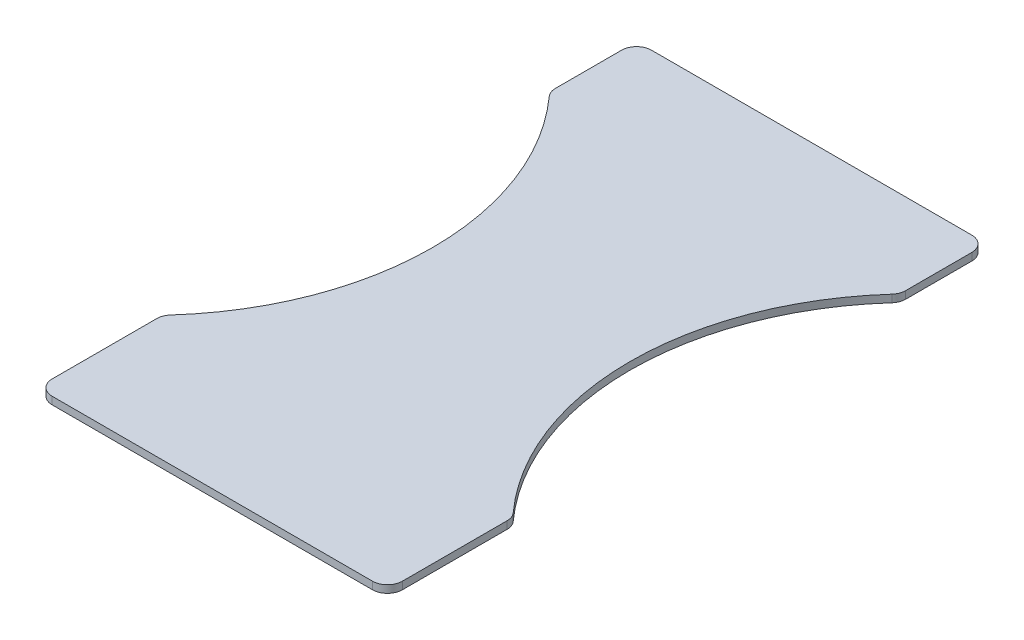
ISO-10303-21;
HEADER;
FILE_DESCRIPTION(('STEP AP214'),'2;1');
FILE_NAME('part.step','',(''),(''),'','','');
FILE_SCHEMA(('AUTOMOTIVE_DESIGN { 1 0 10303 214 1 1 1 1 }'));
ENDSEC;
DATA;
#1=APPLICATION_CONTEXT('core data for automotive mechanical design processes');
#2=APPLICATION_PROTOCOL_DEFINITION('international standard','automotive_design',2000,#1);
#3=PRODUCT_CONTEXT('',#1,'mechanical');
#4=PRODUCT('Part','Part','',(#3));
#5=PRODUCT_RELATED_PRODUCT_CATEGORY('part','',(#4));
#6=PRODUCT_DEFINITION_FORMATION('','',#4);
#7=PRODUCT_DEFINITION_CONTEXT('part definition',#1,'design');
#8=PRODUCT_DEFINITION('design','',#6,#7);
#9=PRODUCT_DEFINITION_SHAPE('','',#8);
#10=(LENGTH_UNIT() NAMED_UNIT(*) SI_UNIT(.MILLI.,.METRE.));
#11=(NAMED_UNIT(*) PLANE_ANGLE_UNIT() SI_UNIT($,.RADIAN.));
#12=(NAMED_UNIT(*) SI_UNIT($,.STERADIAN.) SOLID_ANGLE_UNIT());
#13=UNCERTAINTY_MEASURE_WITH_UNIT(LENGTH_MEASURE(1.E-05),#10,'distance_accuracy_value','');
#14=(GEOMETRIC_REPRESENTATION_CONTEXT(3) GLOBAL_UNCERTAINTY_ASSIGNED_CONTEXT((#13)) GLOBAL_UNIT_ASSIGNED_CONTEXT((#10,
#11,#12)) REPRESENTATION_CONTEXT('',''));
#15=CARTESIAN_POINT('',(0.,0.,0.));
#16=DIRECTION('',(0.,0.,1.));
#17=DIRECTION('',(1.,0.,0.));
#18=AXIS2_PLACEMENT_3D('',#15,#16,#17);
#19=CARTESIAN_POINT('',(-54.2925,2.54,46.5352889447236));
#20=DIRECTION('',(0.,1.,0.));
#21=DIRECTION('',(0.,0.,1.));
#22=AXIS2_PLACEMENT_3D('',#19,#20,#21);
#23=CYLINDRICAL_SURFACE('',#22,5.08);
#24=DIRECTION('',(0.,1.,0.));
#25=VECTOR('',#24,1.);
#26=CARTESIAN_POINT('',(-59.3725,2.54,46.5352889447236));
#27=LINE('',#26,#25);
#28=CARTESIAN_POINT('',(-59.3725,0.,46.5352889447236));
#29=VERTEX_POINT('',#28);
#30=CARTESIAN_POINT('',(-59.3725,2.54,46.5352889447236));
#31=VERTEX_POINT('',#30);
#32=EDGE_CURVE('E243',#29,#31,#27,.T.);
#33=ORIENTED_EDGE('',*,*,#32,.F.);
#34=CARTESIAN_POINT('',(-54.2925,0.,46.5352889447236));
#35=DIRECTION('',(0.,1.,0.));
#36=DIRECTION('',(0.,0.,1.));
#37=AXIS2_PLACEMENT_3D('',#34,#35,#36);
#38=CIRCLE('',#37,5.08);
#39=CARTESIAN_POINT('',(-54.2925,0.,51.6152889447236));
#40=VERTEX_POINT('',#39);
#41=EDGE_CURVE('E43',#40,#29,#38,.F.);
#42=ORIENTED_EDGE('',*,*,#41,.F.);
#43=DIRECTION('',(0.,1.,0.));
#44=VECTOR('',#43,1.);
#45=CARTESIAN_POINT('',(-54.2925,2.54,51.6152889447236));
#46=LINE('',#45,#44);
#47=CARTESIAN_POINT('',(-54.2925,2.54,51.6152889447236));
#48=VERTEX_POINT('',#47);
#49=EDGE_CURVE('E246',#48,#40,#46,.F.);
#50=ORIENTED_EDGE('',*,*,#49,.F.);
#51=CARTESIAN_POINT('',(-54.2925,2.54,46.5352889447236));
#52=DIRECTION('',(0.,1.,0.));
#53=DIRECTION('',(0.,0.,1.));
#54=AXIS2_PLACEMENT_3D('',#51,#52,#53);
#55=CIRCLE('',#54,5.08);
#56=EDGE_CURVE('E11',#31,#48,#55,.T.);
#57=ORIENTED_EDGE('',*,*,#56,.F.);
#58=EDGE_LOOP('',(#33,#42,#50,#57));
#59=FACE_BOUND('',#58,.T.);
#60=ADVANCED_FACE('F36',(#59),#23,.T.);
#61=CARTESIAN_POINT('',(54.2925,2.54,46.5352889447236));
#62=DIRECTION('',(0.,-1.,0.));
#63=DIRECTION('',(0.,0.,-1.));
#64=AXIS2_PLACEMENT_3D('',#61,#62,#63);
#65=CYLINDRICAL_SURFACE('',#64,5.08);
#66=DIRECTION('',(0.,-1.,0.));
#67=VECTOR('',#66,1.);
#68=CARTESIAN_POINT('',(59.3725,2.54,46.5352889447236));
#69=LINE('',#68,#67);
#70=CARTESIAN_POINT('',(59.3725,2.54,46.5352889447236));
#71=VERTEX_POINT('',#70);
#72=CARTESIAN_POINT('',(59.3725,0.,46.5352889447236));
#73=VERTEX_POINT('',#72);
#74=EDGE_CURVE('E232',#71,#73,#69,.T.);
#75=ORIENTED_EDGE('',*,*,#74,.F.);
#76=CARTESIAN_POINT('',(54.2925,2.54,46.5352889447236));
#77=DIRECTION('',(0.,1.,0.));
#78=DIRECTION('',(0.,0.,1.));
#79=AXIS2_PLACEMENT_3D('',#76,#77,#78);
#80=CIRCLE('',#79,5.08);
#81=CARTESIAN_POINT('',(54.2925,2.54,51.6152889447236));
#82=VERTEX_POINT('',#81);
#83=EDGE_CURVE('E238',#82,#71,#80,.T.);
#84=ORIENTED_EDGE('',*,*,#83,.F.);
#85=DIRECTION('',(0.,-1.,0.));
#86=VECTOR('',#85,1.);
#87=CARTESIAN_POINT('',(54.2925,2.54,51.6152889447236));
#88=LINE('',#87,#86);
#89=CARTESIAN_POINT('',(54.2925,0.,51.6152889447236));
#90=VERTEX_POINT('',#89);
#91=EDGE_CURVE('E235',#90,#82,#88,.F.);
#92=ORIENTED_EDGE('',*,*,#91,.F.);
#93=CARTESIAN_POINT('',(54.2925,0.,46.5352889447236));
#94=DIRECTION('',(0.,1.,0.));
#95=DIRECTION('',(0.,0.,1.));
#96=AXIS2_PLACEMENT_3D('',#93,#94,#95);
#97=CIRCLE('',#96,5.08);
#98=EDGE_CURVE('E240',#73,#90,#97,.F.);
#99=ORIENTED_EDGE('',*,*,#98,.F.);
#100=EDGE_LOOP('',(#75,#84,#92,#99));
#101=FACE_BOUND('',#100,.T.);
#102=ADVANCED_FACE('F328',(#101),#65,.T.);
#103=CARTESIAN_POINT('',(54.2925,2.54,11.0794075753311));
#104=DIRECTION('',(0.,-1.,0.));
#105=DIRECTION('',(0.,0.,-1.));
#106=AXIS2_PLACEMENT_3D('',#103,#104,#105);
#107=CYLINDRICAL_SURFACE('',#106,5.08);
#108=DIRECTION('',(0.,-1.,0.));
#109=VECTOR('',#108,1.);
#110=CARTESIAN_POINT('',(58.0705904522613,2.54,7.68346403420268));
#111=LINE('',#110,#109);
#112=CARTESIAN_POINT('',(58.0705904522613,2.54,7.68346403420268));
#113=VERTEX_POINT('',#112);
#114=CARTESIAN_POINT('',(58.0705904522613,0.,7.68346403420268));
#115=VERTEX_POINT('',#114);
#116=EDGE_CURVE('E221',#113,#115,#111,.T.);
#117=ORIENTED_EDGE('',*,*,#116,.F.);
#118=CARTESIAN_POINT('',(54.2925,2.54,11.0794075753311));
#119=DIRECTION('',(0.,1.,0.));
#120=DIRECTION('',(0.,0.,1.));
#121=AXIS2_PLACEMENT_3D('',#118,#119,#120);
#122=CIRCLE('',#121,5.08);
#123=CARTESIAN_POINT('',(59.3725,2.54,11.0794075753311));
#124=VERTEX_POINT('',#123);
#125=EDGE_CURVE('E227',#124,#113,#122,.T.);
#126=ORIENTED_EDGE('',*,*,#125,.F.);
#127=DIRECTION('',(0.,-1.,0.));
#128=VECTOR('',#127,1.);
#129=CARTESIAN_POINT('',(59.3725,2.54,11.0794075753311));
#130=LINE('',#129,#128);
#131=CARTESIAN_POINT('',(59.3725,0.,11.0794075753311));
#132=VERTEX_POINT('',#131);
#133=EDGE_CURVE('E224',#132,#124,#130,.F.);
#134=ORIENTED_EDGE('',*,*,#133,.F.);
#135=CARTESIAN_POINT('',(54.2925,0.,11.0794075753311));
#136=DIRECTION('',(0.,1.,0.));
#137=DIRECTION('',(0.,0.,1.));
#138=AXIS2_PLACEMENT_3D('',#135,#136,#137);
#139=CIRCLE('',#138,5.08);
#140=EDGE_CURVE('E229',#115,#132,#139,.F.);
#141=ORIENTED_EDGE('',*,*,#140,.F.);
#142=EDGE_LOOP('',(#117,#126,#134,#141));
#143=FACE_BOUND('',#142,.T.);
#144=ADVANCED_FACE('F287',(#143),#107,.T.);
#145=CARTESIAN_POINT('',(-54.2925,2.54,11.0794075753311));
#146=DIRECTION('',(0.,-1.,0.));
#147=DIRECTION('',(0.,0.,-1.));
#148=AXIS2_PLACEMENT_3D('',#145,#146,#147);
#149=CYLINDRICAL_SURFACE('',#148,5.08);
#150=DIRECTION('',(0.,-1.,0.));
#151=VECTOR('',#150,1.);
#152=CARTESIAN_POINT('',(-58.0705904522613,2.54,7.68346403420263));
#153=LINE('',#152,#151);
#154=CARTESIAN_POINT('',(-58.0705904522613,0.,7.68346403420264));
#155=VERTEX_POINT('',#154);
#156=CARTESIAN_POINT('',(-58.0705904522613,2.54,7.68346403420264));
#157=VERTEX_POINT('',#156);
#158=EDGE_CURVE('E211',#155,#157,#153,.F.);
#159=ORIENTED_EDGE('',*,*,#158,.F.);
#160=CARTESIAN_POINT('',(-54.2925,0.,11.0794075753311));
#161=DIRECTION('',(0.,1.,0.));
#162=DIRECTION('',(0.,0.,1.));
#163=AXIS2_PLACEMENT_3D('',#160,#161,#162);
#164=CIRCLE('',#163,5.08);
#165=CARTESIAN_POINT('',(-59.3725,0.,11.0794075753311));
#166=VERTEX_POINT('',#165);
#167=EDGE_CURVE('E217',#166,#155,#164,.F.);
#168=ORIENTED_EDGE('',*,*,#167,.F.);
#169=DIRECTION('',(0.,-1.,0.));
#170=VECTOR('',#169,1.);
#171=CARTESIAN_POINT('',(-59.3725,2.54,11.0794075753311));
#172=LINE('',#171,#170);
#173=CARTESIAN_POINT('',(-59.3725,2.54,11.0794075753311));
#174=VERTEX_POINT('',#173);
#175=EDGE_CURVE('E214',#174,#166,#172,.T.);
#176=ORIENTED_EDGE('',*,*,#175,.F.);
#177=CARTESIAN_POINT('',(-54.2925,2.54,11.0794075753311));
#178=DIRECTION('',(0.,1.,0.));
#179=DIRECTION('',(0.,0.,1.));
#180=AXIS2_PLACEMENT_3D('',#177,#178,#179);
#181=CIRCLE('',#180,5.08);
#182=EDGE_CURVE('E219',#157,#174,#181,.T.);
#183=ORIENTED_EDGE('',*,*,#182,.F.);
#184=EDGE_LOOP('',(#159,#168,#176,#183));
#185=FACE_BOUND('',#184,.T.);
#186=ADVANCED_FACE('F320',(#185),#149,.T.);
#187=CARTESIAN_POINT('',(54.2925,2.54,-124.079145361581));
#188=DIRECTION('',(0.,-1.,0.));
#189=DIRECTION('',(0.,0.,-1.));
#190=AXIS2_PLACEMENT_3D('',#187,#188,#189);
#191=CYLINDRICAL_SURFACE('',#190,5.08);
#192=DIRECTION('',(0.,-1.,0.));
#193=VECTOR('',#192,1.);
#194=CARTESIAN_POINT('',(59.3725,2.54,-124.079145361581));
#195=LINE('',#194,#193);
#196=CARTESIAN_POINT('',(59.3725,2.54,-124.079145361581));
#197=VERTEX_POINT('',#196);
#198=CARTESIAN_POINT('',(59.3725,0.,-124.079145361581));
#199=VERTEX_POINT('',#198);
#200=EDGE_CURVE('E200',#197,#199,#195,.T.);
#201=ORIENTED_EDGE('',*,*,#200,.F.);
#202=CARTESIAN_POINT('',(54.2925,2.54,-124.079145361581));
#203=DIRECTION('',(0.,1.,0.));
#204=DIRECTION('',(0.,0.,1.));
#205=AXIS2_PLACEMENT_3D('',#202,#203,#204);
#206=CIRCLE('',#205,5.08);
#207=CARTESIAN_POINT('',(58.0705904522613,2.54,-120.683201820452));
#208=VERTEX_POINT('',#207);
#209=EDGE_CURVE('E206',#208,#197,#206,.T.);
#210=ORIENTED_EDGE('',*,*,#209,.F.);
#211=DIRECTION('',(0.,-1.,0.));
#212=VECTOR('',#211,1.);
#213=CARTESIAN_POINT('',(58.0705904522613,2.54,-120.683201820452));
#214=LINE('',#213,#212);
#215=CARTESIAN_POINT('',(58.0705904522613,0.,-120.683201820452));
#216=VERTEX_POINT('',#215);
#217=EDGE_CURVE('E203',#216,#208,#214,.F.);
#218=ORIENTED_EDGE('',*,*,#217,.F.);
#219=CARTESIAN_POINT('',(54.2925,0.,-124.079145361581));
#220=DIRECTION('',(0.,1.,0.));
#221=DIRECTION('',(0.,0.,1.));
#222=AXIS2_PLACEMENT_3D('',#219,#220,#221);
#223=CIRCLE('',#222,5.08);
#224=EDGE_CURVE('E208',#199,#216,#223,.F.);
#225=ORIENTED_EDGE('',*,*,#224,.F.);
#226=EDGE_LOOP('',(#201,#210,#218,#225));
#227=FACE_BOUND('',#226,.T.);
#228=ADVANCED_FACE('F298',(#227),#191,.T.);
#229=CARTESIAN_POINT('',(-54.2925,2.54,-124.079145361581));
#230=DIRECTION('',(0.,-1.,0.));
#231=DIRECTION('',(0.,0.,-1.));
#232=AXIS2_PLACEMENT_3D('',#229,#230,#231);
#233=CYLINDRICAL_SURFACE('',#232,5.08);
#234=DIRECTION('',(0.,-1.,0.));
#235=VECTOR('',#234,1.);
#236=CARTESIAN_POINT('',(-59.3725,2.54,-124.079145361581));
#237=LINE('',#236,#235);
#238=CARTESIAN_POINT('',(-59.3725,0.,-124.079145361581));
#239=VERTEX_POINT('',#238);
#240=CARTESIAN_POINT('',(-59.3725,2.54,-124.079145361581));
#241=VERTEX_POINT('',#240);
#242=EDGE_CURVE('E190',#239,#241,#237,.F.);
#243=ORIENTED_EDGE('',*,*,#242,.F.);
#244=CARTESIAN_POINT('',(-54.2925,0.,-124.079145361581));
#245=DIRECTION('',(0.,1.,0.));
#246=DIRECTION('',(0.,0.,1.));
#247=AXIS2_PLACEMENT_3D('',#244,#245,#246);
#248=CIRCLE('',#247,5.08);
#249=CARTESIAN_POINT('',(-58.0705904522613,0.,-120.683201820452));
#250=VERTEX_POINT('',#249);
#251=EDGE_CURVE('E196',#250,#239,#248,.F.);
#252=ORIENTED_EDGE('',*,*,#251,.F.);
#253=DIRECTION('',(0.,-1.,0.));
#254=VECTOR('',#253,1.);
#255=CARTESIAN_POINT('',(-58.0705904522613,2.54,-120.683201820452));
#256=LINE('',#255,#254);
#257=CARTESIAN_POINT('',(-58.0705904522613,2.54,-120.683201820452));
#258=VERTEX_POINT('',#257);
#259=EDGE_CURVE('E193',#258,#250,#256,.T.);
#260=ORIENTED_EDGE('',*,*,#259,.F.);
#261=CARTESIAN_POINT('',(-54.2925,2.54,-124.079145361581));
#262=DIRECTION('',(0.,1.,0.));
#263=DIRECTION('',(0.,0.,1.));
#264=AXIS2_PLACEMENT_3D('',#261,#262,#263);
#265=CIRCLE('',#264,5.08);
#266=EDGE_CURVE('E198',#241,#258,#265,.T.);
#267=ORIENTED_EDGE('',*,*,#266,.F.);
#268=EDGE_LOOP('',(#243,#252,#260,#267));
#269=FACE_BOUND('',#268,.T.);
#270=ADVANCED_FACE('F312',(#269),#233,.T.);
#271=CARTESIAN_POINT('',(54.2925,2.54,-146.504711055276));
#272=DIRECTION('',(0.,-1.,0.));
#273=DIRECTION('',(0.,0.,-1.));
#274=AXIS2_PLACEMENT_3D('',#271,#272,#273);
#275=CYLINDRICAL_SURFACE('',#274,5.08);
#276=DIRECTION('',(0.,-1.,0.));
#277=VECTOR('',#276,1.);
#278=CARTESIAN_POINT('',(54.2925,2.54,-151.584711055276));
#279=LINE('',#278,#277);
#280=CARTESIAN_POINT('',(54.2925,2.54,-151.584711055276));
#281=VERTEX_POINT('',#280);
#282=CARTESIAN_POINT('',(54.2925,0.,-151.584711055276));
#283=VERTEX_POINT('',#282);
#284=EDGE_CURVE('E153',#281,#283,#279,.T.);
#285=ORIENTED_EDGE('',*,*,#284,.F.);
#286=CARTESIAN_POINT('',(54.2925,2.54,-146.504711055276));
#287=DIRECTION('',(0.,1.,0.));
#288=DIRECTION('',(0.,0.,1.));
#289=AXIS2_PLACEMENT_3D('',#286,#287,#288);
#290=CIRCLE('',#289,5.08);
#291=CARTESIAN_POINT('',(59.3725,2.54,-146.504711055276));
#292=VERTEX_POINT('',#291);
#293=EDGE_CURVE('E186',#292,#281,#290,.T.);
#294=ORIENTED_EDGE('',*,*,#293,.F.);
#295=DIRECTION('',(0.,-1.,0.));
#296=VECTOR('',#295,1.);
#297=CARTESIAN_POINT('',(59.3725,2.54,-146.504711055276));
#298=LINE('',#297,#296);
#299=CARTESIAN_POINT('',(59.3725,0.,-146.504711055276));
#300=VERTEX_POINT('',#299);
#301=EDGE_CURVE('E183',#300,#292,#298,.F.);
#302=ORIENTED_EDGE('',*,*,#301,.F.);
#303=CARTESIAN_POINT('',(54.2925,0.,-146.504711055276));
#304=DIRECTION('',(0.,1.,0.));
#305=DIRECTION('',(0.,0.,1.));
#306=AXIS2_PLACEMENT_3D('',#303,#304,#305);
#307=CIRCLE('',#306,5.08);
#308=EDGE_CURVE('E188',#283,#300,#307,.F.);
#309=ORIENTED_EDGE('',*,*,#308,.F.);
#310=EDGE_LOOP('',(#285,#294,#302,#309));
#311=FACE_BOUND('',#310,.T.);
#312=ADVANCED_FACE('F306',(#311),#275,.T.);
#313=CARTESIAN_POINT('',(-54.2925,2.54,-146.504711055276));
#314=DIRECTION('',(0.,1.,0.));
#315=DIRECTION('',(0.,0.,1.));
#316=AXIS2_PLACEMENT_3D('',#313,#314,#315);
#317=CYLINDRICAL_SURFACE('',#316,5.08);
#318=DIRECTION('',(0.,1.,0.));
#319=VECTOR('',#318,1.);
#320=CARTESIAN_POINT('',(-54.2925,2.54,-151.584711055276));
#321=LINE('',#320,#319);
#322=CARTESIAN_POINT('',(-54.2925,0.,-151.584711055276));
#323=VERTEX_POINT('',#322);
#324=CARTESIAN_POINT('',(-54.2925,2.54,-151.584711055276));
#325=VERTEX_POINT('',#324);
#326=EDGE_CURVE('E151',#323,#325,#321,.T.);
#327=ORIENTED_EDGE('',*,*,#326,.F.);
#328=CARTESIAN_POINT('',(-54.2925,0.,-146.504711055276));
#329=DIRECTION('',(0.,1.,0.));
#330=DIRECTION('',(0.,0.,1.));
#331=AXIS2_PLACEMENT_3D('',#328,#329,#330);
#332=CIRCLE('',#331,5.08);
#333=CARTESIAN_POINT('',(-59.3725,0.,-146.504711055276));
#334=VERTEX_POINT('',#333);
#335=EDGE_CURVE('E160',#334,#323,#332,.F.);
#336=ORIENTED_EDGE('',*,*,#335,.F.);
#337=DIRECTION('',(0.,1.,0.));
#338=VECTOR('',#337,1.);
#339=CARTESIAN_POINT('',(-59.3725,2.54,-146.504711055276));
#340=LINE('',#339,#338);
#341=CARTESIAN_POINT('',(-59.3725,2.54,-146.504711055276));
#342=VERTEX_POINT('',#341);
#343=EDGE_CURVE('E168',#342,#334,#340,.F.);
#344=ORIENTED_EDGE('',*,*,#343,.F.);
#345=CARTESIAN_POINT('',(-54.2925,2.54,-146.504711055276));
#346=DIRECTION('',(0.,1.,0.));
#347=DIRECTION('',(0.,0.,1.));
#348=AXIS2_PLACEMENT_3D('',#345,#346,#347);
#349=CIRCLE('',#348,5.08);
#350=EDGE_CURVE('E167',#325,#342,#349,.T.);
#351=ORIENTED_EDGE('',*,*,#350,.F.);
#352=EDGE_LOOP('',(#327,#336,#344,#351));
#353=FACE_BOUND('',#352,.T.);
#354=ADVANCED_FACE('F171',(#353),#317,.T.);
#355=CARTESIAN_POINT('',(59.3725,2.54,51.6152889447236));
#356=DIRECTION('',(-1.,0.,0.));
#357=DIRECTION('',(0.,0.,1.));
#358=AXIS2_PLACEMENT_3D('',#355,#356,#357);
#359=PLANE('',#358);
#360=DIRECTION('',(0.,0.,-1.));
#361=VECTOR('',#360,1.);
#362=CARTESIAN_POINT('',(59.3725,2.54,51.6152889447236));
#363=LINE('',#362,#361);
#364=EDGE_CURVE('E255',#71,#124,#363,.T.);
#365=ORIENTED_EDGE('',*,*,#364,.F.);
#366=ORIENTED_EDGE('',*,*,#74,.T.);
#367=DIRECTION('',(0.,0.,-1.));
#368=VECTOR('',#367,1.);
#369=CARTESIAN_POINT('',(59.3725,0.,51.6152889447236));
#370=LINE('',#369,#368);
#371=EDGE_CURVE('E263',#73,#132,#370,.T.);
#372=ORIENTED_EDGE('',*,*,#371,.T.);
#373=ORIENTED_EDGE('',*,*,#133,.T.);
#374=EDGE_LOOP('',(#365,#366,#372,#373));
#375=FACE_BOUND('',#374,.T.);
#376=ADVANCED_FACE('F289',(#375),#359,.F.);
#377=CARTESIAN_POINT('',(129.4765,2.54,-56.4998688931249));
#378=DIRECTION('',(0.,-1.,0.));
#379=DIRECTION('',(0.,0.,-1.));
#380=AXIS2_PLACEMENT_3D('',#377,#378,#379);
#381=CYLINDRICAL_SURFACE('',#380,96.012);
#382=CARTESIAN_POINT('',(129.4765,2.54,-56.4998688931249));
#383=DIRECTION('',(0.,-1.,0.));
#384=DIRECTION('',(0.,0.,1.));
#385=AXIS2_PLACEMENT_3D('',#382,#383,#384);
#386=CIRCLE('',#385,96.012);
#387=EDGE_CURVE('E276',#113,#208,#386,.T.);
#388=ORIENTED_EDGE('',*,*,#387,.F.);
#389=ORIENTED_EDGE('',*,*,#116,.T.);
#390=CARTESIAN_POINT('',(129.4765,0.,-56.4998688931249));
#391=DIRECTION('',(0.,-1.,0.));
#392=DIRECTION('',(0.,0.,1.));
#393=AXIS2_PLACEMENT_3D('',#390,#391,#392);
#394=CIRCLE('',#393,96.012);
#395=EDGE_CURVE('E261',#115,#216,#394,.T.);
#396=ORIENTED_EDGE('',*,*,#395,.T.);
#397=ORIENTED_EDGE('',*,*,#217,.T.);
#398=EDGE_LOOP('',(#388,#389,#396,#397));
#399=FACE_BOUND('',#398,.T.);
#400=ADVANCED_FACE('F293',(#399),#381,.F.);
#401=CARTESIAN_POINT('',(59.3725,2.54,-122.102714319219));
#402=DIRECTION('',(-1.,0.,0.));
#403=DIRECTION('',(0.,0.,1.));
#404=AXIS2_PLACEMENT_3D('',#401,#402,#403);
#405=PLANE('',#404);
#406=DIRECTION('',(0.,0.,-1.));
#407=VECTOR('',#406,1.);
#408=CARTESIAN_POINT('',(59.3725,2.54,-122.102714319219));
#409=LINE('',#408,#407);
#410=EDGE_CURVE('E274',#197,#292,#409,.T.);
#411=ORIENTED_EDGE('',*,*,#410,.F.);
#412=ORIENTED_EDGE('',*,*,#200,.T.);
#413=DIRECTION('',(0.,0.,-1.));
#414=VECTOR('',#413,1.);
#415=CARTESIAN_POINT('',(59.3725,0.,-122.102714319219));
#416=LINE('',#415,#414);
#417=EDGE_CURVE('E157',#199,#300,#416,.T.);
#418=ORIENTED_EDGE('',*,*,#417,.T.);
#419=ORIENTED_EDGE('',*,*,#301,.T.);
#420=EDGE_LOOP('',(#411,#412,#418,#419));
#421=FACE_BOUND('',#420,.T.);
#422=ADVANCED_FACE('F302',(#421),#405,.F.);
#423=CARTESIAN_POINT('',(59.3725,2.54,-151.584711055276));
#424=DIRECTION('',(0.,0.,1.));
#425=DIRECTION('',(1.,0.,0.));
#426=AXIS2_PLACEMENT_3D('',#423,#424,#425);
#427=PLANE('',#426);
#428=DIRECTION('',(-1.,0.,0.));
#429=VECTOR('',#428,1.);
#430=CARTESIAN_POINT('',(59.3725,2.54,-151.584711055276));
#431=LINE('',#430,#429);
#432=EDGE_CURVE('E272',#281,#325,#431,.T.);
#433=ORIENTED_EDGE('',*,*,#432,.F.);
#434=ORIENTED_EDGE('',*,*,#284,.T.);
#435=DIRECTION('',(-1.,0.,0.));
#436=VECTOR('',#435,1.);
#437=CARTESIAN_POINT('',(59.3725,0.,-151.584711055276));
#438=LINE('',#437,#436);
#439=EDGE_CURVE('E146',#283,#323,#438,.T.);
#440=ORIENTED_EDGE('',*,*,#439,.T.);
#441=ORIENTED_EDGE('',*,*,#326,.T.);
#442=EDGE_LOOP('',(#433,#434,#440,#441));
#443=FACE_BOUND('',#442,.T.);
#444=ADVANCED_FACE('F149',(#443),#427,.F.);
#445=CARTESIAN_POINT('',(-59.3725,2.54,-122.102714319219));
#446=DIRECTION('',(1.,0.,0.));
#447=DIRECTION('',(0.,0.,-1.));
#448=AXIS2_PLACEMENT_3D('',#445,#446,#447);
#449=PLANE('',#448);
#450=DIRECTION('',(0.,0.,1.));
#451=VECTOR('',#450,1.);
#452=CARTESIAN_POINT('',(-59.3725,0.,-122.102714319219));
#453=LINE('',#452,#451);
#454=EDGE_CURVE('E156',#334,#239,#453,.T.);
#455=ORIENTED_EDGE('',*,*,#454,.T.);
#456=ORIENTED_EDGE('',*,*,#242,.T.);
#457=DIRECTION('',(0.,0.,1.));
#458=VECTOR('',#457,1.);
#459=CARTESIAN_POINT('',(-59.3725,2.54,-122.102714319219));
#460=LINE('',#459,#458);
#461=EDGE_CURVE('E269',#342,#241,#460,.T.);
#462=ORIENTED_EDGE('',*,*,#461,.F.);
#463=ORIENTED_EDGE('',*,*,#343,.T.);
#464=EDGE_LOOP('',(#455,#456,#462,#463));
#465=FACE_BOUND('',#464,.T.);
#466=ADVANCED_FACE('F309',(#465),#449,.F.);
#467=CARTESIAN_POINT('',(-129.4765,2.54,-56.4998688931249));
#468=DIRECTION('',(0.,-1.,0.));
#469=DIRECTION('',(0.,0.,-1.));
#470=AXIS2_PLACEMENT_3D('',#467,#468,#469);
#471=CYLINDRICAL_SURFACE('',#470,96.012);
#472=CARTESIAN_POINT('',(-129.4765,0.,-56.4998688931249));
#473=DIRECTION('',(0.,-1.,0.));
#474=DIRECTION('',(0.,0.,1.));
#475=AXIS2_PLACEMENT_3D('',#472,#473,#474);
#476=CIRCLE('',#475,96.012);
#477=EDGE_CURVE('E254',#250,#155,#476,.T.);
#478=ORIENTED_EDGE('',*,*,#477,.T.);
#479=ORIENTED_EDGE('',*,*,#158,.T.);
#480=CARTESIAN_POINT('',(-129.4765,2.54,-56.4998688931249));
#481=DIRECTION('',(0.,-1.,0.));
#482=DIRECTION('',(0.,0.,1.));
#483=AXIS2_PLACEMENT_3D('',#480,#481,#482);
#484=CIRCLE('',#483,96.012);
#485=EDGE_CURVE('E266',#258,#157,#484,.T.);
#486=ORIENTED_EDGE('',*,*,#485,.F.);
#487=ORIENTED_EDGE('',*,*,#259,.T.);
#488=EDGE_LOOP('',(#478,#479,#486,#487));
#489=FACE_BOUND('',#488,.T.);
#490=ADVANCED_FACE('F316',(#489),#471,.F.);
#491=CARTESIAN_POINT('',(-59.3725,2.54,51.6152889447236));
#492=DIRECTION('',(1.,0.,0.));
#493=DIRECTION('',(0.,0.,-1.));
#494=AXIS2_PLACEMENT_3D('',#491,#492,#493);
#495=PLANE('',#494);
#496=DIRECTION('',(0.,0.,1.));
#497=VECTOR('',#496,1.);
#498=CARTESIAN_POINT('',(-59.3725,0.,51.6152889447236));
#499=LINE('',#498,#497);
#500=EDGE_CURVE('E249',#166,#29,#499,.T.);
#501=ORIENTED_EDGE('',*,*,#500,.T.);
#502=ORIENTED_EDGE('',*,*,#32,.T.);
#503=DIRECTION('',(0.,0.,1.));
#504=VECTOR('',#503,1.);
#505=CARTESIAN_POINT('',(-59.3725,2.54,51.6152889447236));
#506=LINE('',#505,#504);
#507=EDGE_CURVE('E175',#174,#31,#506,.T.);
#508=ORIENTED_EDGE('',*,*,#507,.F.);
#509=ORIENTED_EDGE('',*,*,#175,.T.);
#510=EDGE_LOOP('',(#501,#502,#508,#509));
#511=FACE_BOUND('',#510,.T.);
#512=ADVANCED_FACE('F252',(#511),#495,.F.);
#513=CARTESIAN_POINT('',(59.3725,2.54,51.6152889447236));
#514=DIRECTION('',(0.,0.,-1.));
#515=DIRECTION('',(-1.,0.,0.));
#516=AXIS2_PLACEMENT_3D('',#513,#514,#515);
#517=PLANE('',#516);
#518=DIRECTION('',(1.,0.,0.));
#519=VECTOR('',#518,1.);
#520=CARTESIAN_POINT('',(59.3725,2.54,51.6152889447236));
#521=LINE('',#520,#519);
#522=EDGE_CURVE('E172',#48,#82,#521,.T.);
#523=ORIENTED_EDGE('',*,*,#522,.F.);
#524=ORIENTED_EDGE('',*,*,#49,.T.);
#525=DIRECTION('',(1.,0.,0.));
#526=VECTOR('',#525,1.);
#527=CARTESIAN_POINT('',(59.3725,0.,51.6152889447236));
#528=LINE('',#527,#526);
#529=EDGE_CURVE('E178',#40,#90,#528,.T.);
#530=ORIENTED_EDGE('',*,*,#529,.T.);
#531=ORIENTED_EDGE('',*,*,#91,.T.);
#532=EDGE_LOOP('',(#523,#524,#530,#531));
#533=FACE_BOUND('',#532,.T.);
#534=ADVANCED_FACE('F340',(#533),#517,.F.);
#535=CARTESIAN_POINT('',(129.4765,2.54,-56.4998688931249));
#536=DIRECTION('',(0.,1.,0.));
#537=DIRECTION('',(0.,0.,1.));
#538=AXIS2_PLACEMENT_3D('',#535,#536,#537);
#539=PLANE('',#538);
#540=ORIENTED_EDGE('',*,*,#507,.T.);
#541=ORIENTED_EDGE('',*,*,#56,.T.);
#542=ORIENTED_EDGE('',*,*,#522,.T.);
#543=ORIENTED_EDGE('',*,*,#83,.T.);
#544=ORIENTED_EDGE('',*,*,#364,.T.);
#545=ORIENTED_EDGE('',*,*,#125,.T.);
#546=ORIENTED_EDGE('',*,*,#387,.T.);
#547=ORIENTED_EDGE('',*,*,#209,.T.);
#548=ORIENTED_EDGE('',*,*,#410,.T.);
#549=ORIENTED_EDGE('',*,*,#293,.T.);
#550=ORIENTED_EDGE('',*,*,#432,.T.);
#551=ORIENTED_EDGE('',*,*,#350,.T.);
#552=ORIENTED_EDGE('',*,*,#461,.T.);
#553=ORIENTED_EDGE('',*,*,#266,.T.);
#554=ORIENTED_EDGE('',*,*,#485,.T.);
#555=ORIENTED_EDGE('',*,*,#182,.T.);
#556=EDGE_LOOP('',(#540,#541,#542,#543,#544,#545,#546,#547,#548,#549,#550,#551,#552,#553,#554,#555));
#557=FACE_BOUND('',#556,.T.);
#558=ADVANCED_FACE('F280',(#557),#539,.T.);
#559=CARTESIAN_POINT('',(129.4765,0.,-56.4998688931249));
#560=DIRECTION('',(0.,1.,0.));
#561=DIRECTION('',(0.,0.,1.));
#562=AXIS2_PLACEMENT_3D('',#559,#560,#561);
#563=PLANE('',#562);
#564=ORIENTED_EDGE('',*,*,#529,.F.);
#565=ORIENTED_EDGE('',*,*,#41,.T.);
#566=ORIENTED_EDGE('',*,*,#500,.F.);
#567=ORIENTED_EDGE('',*,*,#167,.T.);
#568=ORIENTED_EDGE('',*,*,#477,.F.);
#569=ORIENTED_EDGE('',*,*,#251,.T.);
#570=ORIENTED_EDGE('',*,*,#454,.F.);
#571=ORIENTED_EDGE('',*,*,#335,.T.);
#572=ORIENTED_EDGE('',*,*,#439,.F.);
#573=ORIENTED_EDGE('',*,*,#308,.T.);
#574=ORIENTED_EDGE('',*,*,#417,.F.);
#575=ORIENTED_EDGE('',*,*,#224,.T.);
#576=ORIENTED_EDGE('',*,*,#395,.F.);
#577=ORIENTED_EDGE('',*,*,#140,.T.);
#578=ORIENTED_EDGE('',*,*,#371,.F.);
#579=ORIENTED_EDGE('',*,*,#98,.T.);
#580=EDGE_LOOP('',(#564,#565,#566,#567,#568,#569,#570,#571,#572,#573,#574,#575,#576,#577,#578,#579));
#581=FACE_BOUND('',#580,.T.);
#582=ADVANCED_FACE('F162',(#581),#563,.F.);
#583=CLOSED_SHELL('',(#60,#102,#144,#186,#228,#270,#312,#354,#376,#400,#422,#444,#466,#490,#512,
#534,#558,#582));
#584=MANIFOLD_SOLID_BREP('B2',#583);
#585=ADVANCED_BREP_SHAPE_REPRESENTATION('',(#18,#584),#14);
#586=SHAPE_DEFINITION_REPRESENTATION(#9,#585);
ENDSEC;
END-ISO-10303-21;
